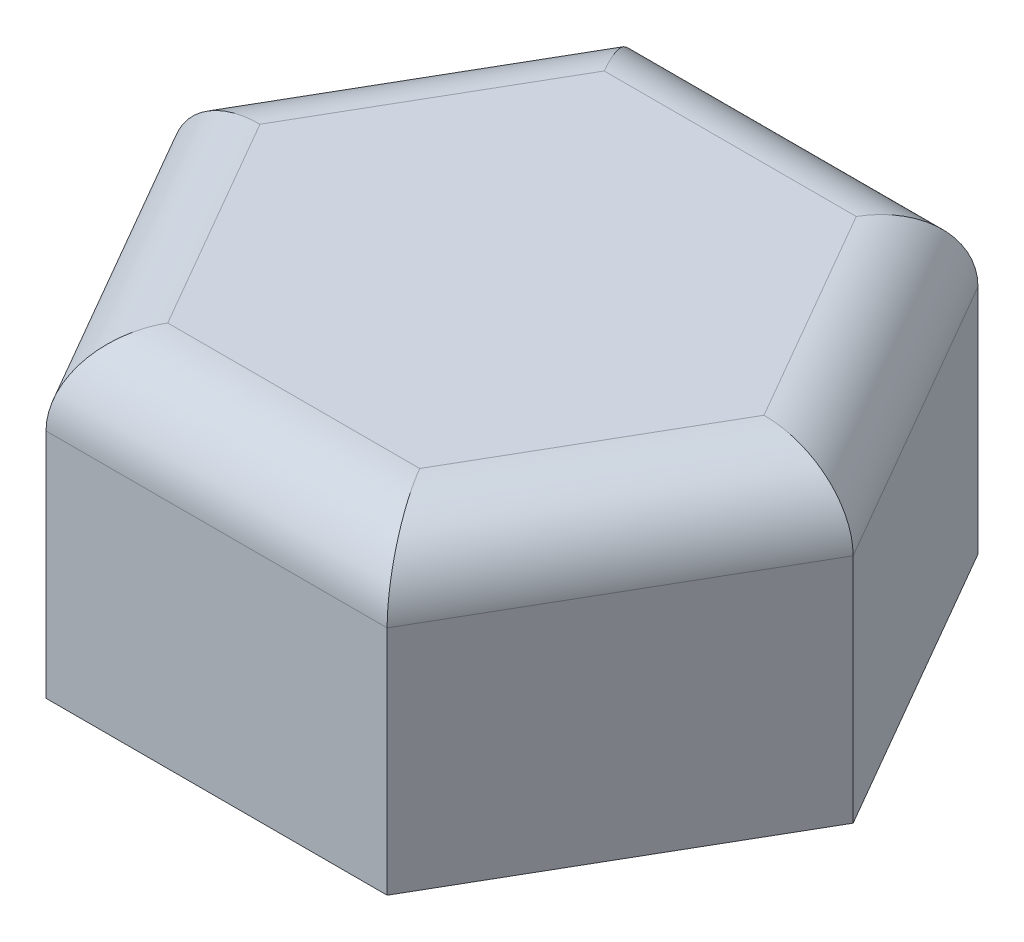
ISO-10303-21;
HEADER;
FILE_DESCRIPTION(('STEP AP214'),'2;1');
FILE_NAME('part.step','',(''),(''),'','','');
FILE_SCHEMA(('AUTOMOTIVE_DESIGN { 1 0 10303 214 1 1 1 1 }'));
ENDSEC;
DATA;
#1=APPLICATION_CONTEXT('core data for automotive mechanical design processes');
#2=APPLICATION_PROTOCOL_DEFINITION('international standard','automotive_design',2000,#1);
#3=PRODUCT_CONTEXT('',#1,'mechanical');
#4=PRODUCT('Part','Part','',(#3));
#5=PRODUCT_RELATED_PRODUCT_CATEGORY('part','',(#4));
#6=PRODUCT_DEFINITION_FORMATION('','',#4);
#7=PRODUCT_DEFINITION_CONTEXT('part definition',#1,'design');
#8=PRODUCT_DEFINITION('design','',#6,#7);
#9=PRODUCT_DEFINITION_SHAPE('','',#8);
#10=(LENGTH_UNIT() NAMED_UNIT(*) SI_UNIT(.MILLI.,.METRE.));
#11=(NAMED_UNIT(*) PLANE_ANGLE_UNIT() SI_UNIT($,.RADIAN.));
#12=(NAMED_UNIT(*) SI_UNIT($,.STERADIAN.) SOLID_ANGLE_UNIT());
#13=UNCERTAINTY_MEASURE_WITH_UNIT(LENGTH_MEASURE(1.E-05),#10,'distance_accuracy_value','');
#14=(GEOMETRIC_REPRESENTATION_CONTEXT(3) GLOBAL_UNCERTAINTY_ASSIGNED_CONTEXT((#13)) GLOBAL_UNIT_ASSIGNED_CONTEXT((#10,
#11,#12)) REPRESENTATION_CONTEXT('',''));
#15=CARTESIAN_POINT('',(0.,0.,0.));
#16=DIRECTION('',(0.,0.,1.));
#17=DIRECTION('',(1.,0.,0.));
#18=AXIS2_PLACEMENT_3D('',#15,#16,#17);
#19=CARTESIAN_POINT('',(0.,4.,0.));
#20=DIRECTION('',(0.,-1.,0.));
#21=DIRECTION('',(0.,0.,-1.));
#22=AXIS2_PLACEMENT_3D('',#19,#20,#21);
#23=CYLINDRICAL_SURFACE('',#22,2.4);
#24=CARTESIAN_POINT('',(0.,0.,0.));
#25=DIRECTION('',(0.,1.,0.));
#26=DIRECTION('',(0.,0.,1.));
#27=AXIS2_PLACEMENT_3D('',#24,#25,#26);
#28=CIRCLE('',#27,2.4);
#29=CARTESIAN_POINT('',(0.,0.,2.4));
#30=VERTEX_POINT('',#29);
#31=EDGE_CURVE('E144',#30,#30,#28,.T.);
#32=ORIENTED_EDGE('',*,*,#31,.F.);
#33=EDGE_LOOP('',(#32));
#34=FACE_BOUND('',#33,.T.);
#35=CARTESIAN_POINT('',(0.,1.,0.));
#36=DIRECTION('',(0.,1.,0.));
#37=DIRECTION('',(0.,0.,1.));
#38=AXIS2_PLACEMENT_3D('',#35,#36,#37);
#39=CIRCLE('',#38,2.4);
#40=CARTESIAN_POINT('',(0.,1.,2.4));
#41=VERTEX_POINT('',#40);
#42=EDGE_CURVE('E212',#41,#41,#39,.T.);
#43=ORIENTED_EDGE('',*,*,#42,.T.);
#44=EDGE_LOOP('',(#43));
#45=FACE_BOUND('',#44,.T.);
#46=ADVANCED_FACE('F41',(#34,#45),#23,.F.);
#47=CARTESIAN_POINT('',(0.,4.,0.));
#48=DIRECTION('',(0.,1.,0.));
#49=DIRECTION('',(0.,0.,1.));
#50=AXIS2_PLACEMENT_3D('',#47,#48,#49);
#51=PLANE('',#50);
#52=DIRECTION('',(-1.,0.,0.));
#53=VECTOR('',#52,1.);
#54=CARTESIAN_POINT('',(-2.20998121972278,4.,-2.82779975633281));
#55=LINE('',#54,#53);
#56=CARTESIAN_POINT('',(1.6326309505331,4.,-2.82779975633285));
#57=VERTEX_POINT('',#56);
#58=CARTESIAN_POINT('',(-1.63263095053316,4.,-2.82779975633282));
#59=VERTEX_POINT('',#58);
#60=EDGE_CURVE('E188',#57,#59,#55,.T.);
#61=ORIENTED_EDGE('',*,*,#60,.T.);
#62=DIRECTION('',(-0.499999999999995,0.,0.866025403784442));
#63=VECTOR('',#62,1.);
#64=CARTESIAN_POINT('',(-3.55393703566106,4.,0.499999999999995));
#65=LINE('',#64,#63);
#66=CARTESIAN_POINT('',(-3.26526190106625,4.,0.));
#67=VERTEX_POINT('',#66);
#68=EDGE_CURVE('E191',#59,#67,#65,.T.);
#69=ORIENTED_EDGE('',*,*,#68,.T.);
#70=DIRECTION('',(0.500000000000001,0.,0.866025403784438));
#71=VECTOR('',#70,1.);
#72=CARTESIAN_POINT('',(-1.3439558159383,4.,3.32779975633284));
#73=LINE('',#72,#71);
#74=CARTESIAN_POINT('',(-1.63263095053312,4.,2.82779975633284));
#75=VERTEX_POINT('',#74);
#76=EDGE_CURVE('E125',#67,#75,#73,.T.);
#77=ORIENTED_EDGE('',*,*,#76,.T.);
#78=DIRECTION('',(1.,0.,0.));
#79=VECTOR('',#78,1.);
#80=CARTESIAN_POINT('',(2.20998121972276,4.,2.82779975633283));
#81=LINE('',#80,#79);
#82=CARTESIAN_POINT('',(1.63263095053314,4.,2.82779975633283));
#83=VERTEX_POINT('',#82);
#84=EDGE_CURVE('E179',#75,#83,#81,.T.);
#85=ORIENTED_EDGE('',*,*,#84,.T.);
#86=DIRECTION('',(0.499999999999995,0.,-0.866025403784442));
#87=VECTOR('',#86,1.);
#88=CARTESIAN_POINT('',(3.55393703566105,4.,-0.500000000000026));
#89=LINE('',#88,#87);
#90=CARTESIAN_POINT('',(3.26526190106624,4.,0.));
#91=VERTEX_POINT('',#90);
#92=EDGE_CURVE('E182',#83,#91,#89,.T.);
#93=ORIENTED_EDGE('',*,*,#92,.T.);
#94=DIRECTION('',(-0.500000000000007,0.,-0.866025403784435));
#95=VECTOR('',#94,1.);
#96=CARTESIAN_POINT('',(1.34395581593828,4.,-3.32779975633285));
#97=LINE('',#96,#95);
#98=EDGE_CURVE('E185',#91,#57,#97,.T.);
#99=ORIENTED_EDGE('',*,*,#98,.T.);
#100=EDGE_LOOP('',(#61,#69,#77,#85,#93,#99));
#101=FACE_BOUND('',#100,.T.);
#102=ADVANCED_FACE('F266',(#101),#51,.T.);
#103=CARTESIAN_POINT('',(0.,0.,0.));
#104=DIRECTION('',(0.,1.,0.));
#105=DIRECTION('',(0.,0.,1.));
#106=AXIS2_PLACEMENT_3D('',#103,#104,#105);
#107=PLANE('',#106);
#108=DIRECTION('',(-0.499999999999995,0.,0.866025403784442));
#109=VECTOR('',#108,1.);
#110=CARTESIAN_POINT('',(-2.20998121972279,0.,-3.82779975633281));
#111=LINE('',#110,#109);
#112=CARTESIAN_POINT('',(-2.20998121972279,0.,-3.82779975633281));
#113=VERTEX_POINT('',#112);
#114=CARTESIAN_POINT('',(-4.4199624394455,0.,0.));
#115=VERTEX_POINT('',#114);
#116=EDGE_CURVE('E133',#113,#115,#111,.T.);
#117=ORIENTED_EDGE('',*,*,#116,.F.);
#118=DIRECTION('',(-1.,0.,0.));
#119=VECTOR('',#118,1.);
#120=CARTESIAN_POINT('',(2.20998121972271,0.,-3.82779975633286));
#121=LINE('',#120,#119);
#122=CARTESIAN_POINT('',(2.20998121972271,0.,-3.82779975633286));
#123=VERTEX_POINT('',#122);
#124=EDGE_CURVE('E161',#123,#113,#121,.T.);
#125=ORIENTED_EDGE('',*,*,#124,.F.);
#126=DIRECTION('',(-0.500000000000007,0.,-0.866025403784435));
#127=VECTOR('',#126,1.);
#128=CARTESIAN_POINT('',(4.4199624394455,0.,0.));
#129=LINE('',#128,#127);
#130=CARTESIAN_POINT('',(4.4199624394455,0.,0.));
#131=VERTEX_POINT('',#130);
#132=EDGE_CURVE('E157',#131,#123,#129,.T.);
#133=ORIENTED_EDGE('',*,*,#132,.F.);
#134=DIRECTION('',(0.499999999999995,0.,-0.866025403784442));
#135=VECTOR('',#134,1.);
#136=CARTESIAN_POINT('',(2.20998121972277,0.,3.82779975633283));
#137=LINE('',#136,#135);
#138=CARTESIAN_POINT('',(2.20998121972277,0.,3.82779975633283));
#139=VERTEX_POINT('',#138);
#140=EDGE_CURVE('E153',#139,#131,#137,.T.);
#141=ORIENTED_EDGE('',*,*,#140,.F.);
#142=DIRECTION('',(1.,0.,0.));
#143=VECTOR('',#142,1.);
#144=CARTESIAN_POINT('',(-2.20998121972274,0.,3.82779975633284));
#145=LINE('',#144,#143);
#146=CARTESIAN_POINT('',(-2.20998121972274,0.,3.82779975633284));
#147=VERTEX_POINT('',#146);
#148=EDGE_CURVE('E136',#147,#139,#145,.T.);
#149=ORIENTED_EDGE('',*,*,#148,.F.);
#150=DIRECTION('',(0.500000000000001,0.,0.866025403784438));
#151=VECTOR('',#150,1.);
#152=CARTESIAN_POINT('',(-4.4199624394455,0.,0.));
#153=LINE('',#152,#151);
#154=EDGE_CURVE('E117',#115,#147,#153,.T.);
#155=ORIENTED_EDGE('',*,*,#154,.F.);
#156=EDGE_LOOP('',(#117,#125,#133,#141,#149,#155));
#157=FACE_BOUND('',#156,.T.);
#158=ORIENTED_EDGE('',*,*,#31,.T.);
#159=EDGE_LOOP('',(#158));
#160=FACE_BOUND('',#159,.T.);
#161=ADVANCED_FACE('F130',(#157,#160),#107,.F.);
#162=CARTESIAN_POINT('',(-2.20998121972279,4.,-3.82779975633281));
#163=DIRECTION('',(0.866025403784442,0.,0.499999999999995));
#164=DIRECTION('',(0.499999999999995,0.,-0.866025403784442));
#165=AXIS2_PLACEMENT_3D('',#162,#163,#164);
#166=PLANE('',#165);
#167=DIRECTION('',(0.,-1.,0.));
#168=VECTOR('',#167,1.);
#169=CARTESIAN_POINT('',(-4.4199624394455,4.,0.));
#170=LINE('',#169,#168);
#171=CARTESIAN_POINT('',(-4.4199624394455,3.,0.));
#172=VERTEX_POINT('',#171);
#173=EDGE_CURVE('E114',#172,#115,#170,.T.);
#174=ORIENTED_EDGE('',*,*,#173,.F.);
#175=DIRECTION('',(-0.499999999999995,0.,0.866025403784442));
#176=VECTOR('',#175,1.);
#177=CARTESIAN_POINT('',(-2.20998121972279,3.,-3.82779975633281));
#178=LINE('',#177,#176);
#179=CARTESIAN_POINT('',(-2.20998121972279,3.,-3.82779975633281));
#180=VERTEX_POINT('',#179);
#181=EDGE_CURVE('E195',#172,#180,#178,.F.);
#182=ORIENTED_EDGE('',*,*,#181,.T.);
#183=DIRECTION('',(0.,-1.,0.));
#184=VECTOR('',#183,1.);
#185=CARTESIAN_POINT('',(-2.20998121972279,4.,-3.82779975633281));
#186=LINE('',#185,#184);
#187=EDGE_CURVE('E141',#180,#113,#186,.T.);
#188=ORIENTED_EDGE('',*,*,#187,.T.);
#189=ORIENTED_EDGE('',*,*,#116,.T.);
#190=EDGE_LOOP('',(#174,#182,#188,#189));
#191=FACE_BOUND('',#190,.T.);
#192=ADVANCED_FACE('F139',(#191),#166,.F.);
#193=CARTESIAN_POINT('',(-4.4199624394455,4.,0.));
#194=DIRECTION('',(0.866025403784438,0.,-0.500000000000001));
#195=DIRECTION('',(-0.500000000000001,0.,-0.866025403784438));
#196=AXIS2_PLACEMENT_3D('',#193,#194,#195);
#197=PLANE('',#196);
#198=DIRECTION('',(0.,-1.,0.));
#199=VECTOR('',#198,1.);
#200=CARTESIAN_POINT('',(-2.20998121972274,4.,3.82779975633284));
#201=LINE('',#200,#199);
#202=CARTESIAN_POINT('',(-2.20998121972274,3.,3.82779975633284));
#203=VERTEX_POINT('',#202);
#204=EDGE_CURVE('E126',#203,#147,#201,.T.);
#205=ORIENTED_EDGE('',*,*,#204,.F.);
#206=DIRECTION('',(0.500000000000001,0.,0.866025403784438));
#207=VECTOR('',#206,1.);
#208=CARTESIAN_POINT('',(-4.4199624394455,3.,0.));
#209=LINE('',#208,#207);
#210=EDGE_CURVE('E11',#203,#172,#209,.F.);
#211=ORIENTED_EDGE('',*,*,#210,.T.);
#212=ORIENTED_EDGE('',*,*,#173,.T.);
#213=ORIENTED_EDGE('',*,*,#154,.T.);
#214=EDGE_LOOP('',(#205,#211,#212,#213));
#215=FACE_BOUND('',#214,.T.);
#216=ADVANCED_FACE('F116',(#215),#197,.F.);
#217=CARTESIAN_POINT('',(-2.20998121972274,4.,3.82779975633284));
#218=DIRECTION('',(0.,0.,-1.));
#219=DIRECTION('',(-1.,0.,0.));
#220=AXIS2_PLACEMENT_3D('',#217,#218,#219);
#221=PLANE('',#220);
#222=DIRECTION('',(0.,-1.,0.));
#223=VECTOR('',#222,1.);
#224=CARTESIAN_POINT('',(2.20998121972277,4.,3.82779975633283));
#225=LINE('',#224,#223);
#226=CARTESIAN_POINT('',(2.20998121972277,3.,3.82779975633283));
#227=VERTEX_POINT('',#226);
#228=EDGE_CURVE('E172',#227,#139,#225,.T.);
#229=ORIENTED_EDGE('',*,*,#228,.F.);
#230=DIRECTION('',(1.,0.,0.));
#231=VECTOR('',#230,1.);
#232=CARTESIAN_POINT('',(-2.20998121972274,3.,3.82779975633284));
#233=LINE('',#232,#231);
#234=EDGE_CURVE('E51',#227,#203,#233,.F.);
#235=ORIENTED_EDGE('',*,*,#234,.T.);
#236=ORIENTED_EDGE('',*,*,#204,.T.);
#237=ORIENTED_EDGE('',*,*,#148,.T.);
#238=EDGE_LOOP('',(#229,#235,#236,#237));
#239=FACE_BOUND('',#238,.T.);
#240=ADVANCED_FACE('F256',(#239),#221,.F.);
#241=CARTESIAN_POINT('',(2.20998121972277,4.,3.82779975633283));
#242=DIRECTION('',(-0.866025403784442,0.,-0.499999999999995));
#243=DIRECTION('',(-0.499999999999995,0.,0.866025403784442));
#244=AXIS2_PLACEMENT_3D('',#241,#242,#243);
#245=PLANE('',#244);
#246=DIRECTION('',(0.,-1.,0.));
#247=VECTOR('',#246,1.);
#248=CARTESIAN_POINT('',(4.4199624394455,4.,0.));
#249=LINE('',#248,#247);
#250=CARTESIAN_POINT('',(4.4199624394455,3.,0.));
#251=VERTEX_POINT('',#250);
#252=EDGE_CURVE('E169',#251,#131,#249,.T.);
#253=ORIENTED_EDGE('',*,*,#252,.F.);
#254=DIRECTION('',(0.499999999999995,0.,-0.866025403784442));
#255=VECTOR('',#254,1.);
#256=CARTESIAN_POINT('',(2.20998121972277,3.,3.82779975633283));
#257=LINE('',#256,#255);
#258=EDGE_CURVE('E66',#251,#227,#257,.F.);
#259=ORIENTED_EDGE('',*,*,#258,.T.);
#260=ORIENTED_EDGE('',*,*,#228,.T.);
#261=ORIENTED_EDGE('',*,*,#140,.T.);
#262=EDGE_LOOP('',(#253,#259,#260,#261));
#263=FACE_BOUND('',#262,.T.);
#264=ADVANCED_FACE('F255',(#263),#245,.F.);
#265=CARTESIAN_POINT('',(4.4199624394455,4.,0.));
#266=DIRECTION('',(-0.866025403784435,0.,0.500000000000007));
#267=DIRECTION('',(0.500000000000007,0.,0.866025403784435));
#268=AXIS2_PLACEMENT_3D('',#265,#266,#267);
#269=PLANE('',#268);
#270=DIRECTION('',(0.,-1.,0.));
#271=VECTOR('',#270,1.);
#272=CARTESIAN_POINT('',(2.20998121972271,4.,-3.82779975633286));
#273=LINE('',#272,#271);
#274=CARTESIAN_POINT('',(2.20998121972271,3.,-3.82779975633286));
#275=VERTEX_POINT('',#274);
#276=EDGE_CURVE('E166',#275,#123,#273,.T.);
#277=ORIENTED_EDGE('',*,*,#276,.F.);
#278=DIRECTION('',(-0.500000000000007,0.,-0.866025403784435));
#279=VECTOR('',#278,1.);
#280=CARTESIAN_POINT('',(4.4199624394455,3.,0.));
#281=LINE('',#280,#279);
#282=EDGE_CURVE('E201',#275,#251,#281,.F.);
#283=ORIENTED_EDGE('',*,*,#282,.T.);
#284=ORIENTED_EDGE('',*,*,#252,.T.);
#285=ORIENTED_EDGE('',*,*,#132,.T.);
#286=EDGE_LOOP('',(#277,#283,#284,#285));
#287=FACE_BOUND('',#286,.T.);
#288=ADVANCED_FACE('F254',(#287),#269,.F.);
#289=CARTESIAN_POINT('',(2.20998121972271,4.,-3.82779975633286));
#290=DIRECTION('',(0.,0.,1.));
#291=DIRECTION('',(1.,0.,0.));
#292=AXIS2_PLACEMENT_3D('',#289,#290,#291);
#293=PLANE('',#292);
#294=ORIENTED_EDGE('',*,*,#187,.F.);
#295=DIRECTION('',(-1.,0.,0.));
#296=VECTOR('',#295,1.);
#297=CARTESIAN_POINT('',(2.20998121972271,3.,-3.82779975633286));
#298=LINE('',#297,#296);
#299=EDGE_CURVE('E198',#180,#275,#298,.F.);
#300=ORIENTED_EDGE('',*,*,#299,.T.);
#301=ORIENTED_EDGE('',*,*,#276,.T.);
#302=ORIENTED_EDGE('',*,*,#124,.T.);
#303=EDGE_LOOP('',(#294,#300,#301,#302));
#304=FACE_BOUND('',#303,.T.);
#305=ADVANCED_FACE('F250',(#304),#293,.F.);
#306=CARTESIAN_POINT('',(2.44894642579969,3.,1.4138998781664));
#307=DIRECTION('',(-0.499999999999995,0.,0.866025403784442));
#308=DIRECTION('',(0.866025403784442,0.,0.499999999999995));
#309=AXIS2_PLACEMENT_3D('',#306,#307,#308);
#310=CYLINDRICAL_SURFACE('',#309,1.);
#311=CARTESIAN_POINT('',(1.63263095053313,3.,2.82779975633283));
#312=DIRECTION('',(-0.866025403784436,0.,0.500000000000004));
#313=DIRECTION('',(-0.500000000000004,0.,-0.866025403784436));
#314=AXIS2_PLACEMENT_3D('',#311,#312,#313);
#315=ELLIPSE('',#314,1.15470053837925,1.);
#316=EDGE_CURVE('E222',#227,#83,#315,.T.);
#317=ORIENTED_EDGE('',*,*,#316,.F.);
#318=ORIENTED_EDGE('',*,*,#258,.F.);
#319=CARTESIAN_POINT('',(3.26526190106624,3.,0.));
#320=DIRECTION('',(0.,0.,1.));
#321=DIRECTION('',(-1.,0.,0.));
#322=AXIS2_PLACEMENT_3D('',#319,#320,#321);
#323=ELLIPSE('',#322,1.15470053837925,1.);
#324=EDGE_CURVE('E45',#91,#251,#323,.F.);
#325=ORIENTED_EDGE('',*,*,#324,.F.);
#326=ORIENTED_EDGE('',*,*,#92,.F.);
#327=EDGE_LOOP('',(#317,#318,#325,#326));
#328=FACE_BOUND('',#327,.T.);
#329=ADVANCED_FACE('F43',(#328),#310,.T.);
#330=CARTESIAN_POINT('',(2.44894642579967,3.,-1.41389987816644));
#331=DIRECTION('',(0.500000000000007,0.,0.866025403784435));
#332=DIRECTION('',(0.866025403784435,0.,-0.500000000000007));
#333=AXIS2_PLACEMENT_3D('',#330,#331,#332);
#334=CYLINDRICAL_SURFACE('',#333,1.);
#335=ORIENTED_EDGE('',*,*,#324,.T.);
#336=ORIENTED_EDGE('',*,*,#282,.F.);
#337=CARTESIAN_POINT('',(1.6326309505331,3.,-2.82779975633285));
#338=DIRECTION('',(0.866025403784443,0.,0.499999999999992));
#339=DIRECTION('',(-0.499999999999992,0.,0.866025403784443));
#340=AXIS2_PLACEMENT_3D('',#337,#338,#339);
#341=ELLIPSE('',#340,1.15470053837925,1.);
#342=EDGE_CURVE('E219',#57,#275,#341,.F.);
#343=ORIENTED_EDGE('',*,*,#342,.F.);
#344=ORIENTED_EDGE('',*,*,#98,.F.);
#345=EDGE_LOOP('',(#335,#336,#343,#344));
#346=FACE_BOUND('',#345,.T.);
#347=ADVANCED_FACE('F234',(#346),#334,.T.);
#348=CARTESIAN_POINT('',(0.,3.,2.82779975633284));
#349=DIRECTION('',(-1.,0.,0.));
#350=DIRECTION('',(0.,0.,1.));
#351=AXIS2_PLACEMENT_3D('',#348,#349,#350);
#352=CYLINDRICAL_SURFACE('',#351,1.);
#353=ORIENTED_EDGE('',*,*,#316,.T.);
#354=ORIENTED_EDGE('',*,*,#84,.F.);
#355=CARTESIAN_POINT('',(-1.63263095053312,3.,2.82779975633284));
#356=DIRECTION('',(-0.86602540378444,0.,-0.499999999999998));
#357=DIRECTION('',(0.499999999999998,0.,-0.86602540378444));
#358=AXIS2_PLACEMENT_3D('',#355,#356,#357);
#359=ELLIPSE('',#358,1.15470053837925,1.);
#360=EDGE_CURVE('E215',#203,#75,#359,.T.);
#361=ORIENTED_EDGE('',*,*,#360,.F.);
#362=ORIENTED_EDGE('',*,*,#234,.F.);
#363=EDGE_LOOP('',(#353,#354,#361,#362));
#364=FACE_BOUND('',#363,.T.);
#365=ADVANCED_FACE('F239',(#364),#352,.T.);
#366=CARTESIAN_POINT('',(0.,3.,-2.82779975633284));
#367=DIRECTION('',(1.,0.,0.));
#368=DIRECTION('',(0.,0.,-1.));
#369=AXIS2_PLACEMENT_3D('',#366,#367,#368);
#370=CYLINDRICAL_SURFACE('',#369,1.);
#371=ORIENTED_EDGE('',*,*,#342,.T.);
#372=ORIENTED_EDGE('',*,*,#299,.F.);
#373=CARTESIAN_POINT('',(-1.63263095053316,3.,-2.82779975633282));
#374=DIRECTION('',(0.866025403784434,0.,-0.500000000000007));
#375=DIRECTION('',(0.500000000000007,0.,0.866025403784435));
#376=AXIS2_PLACEMENT_3D('',#373,#374,#375);
#377=ELLIPSE('',#376,1.15470053837925,1.);
#378=EDGE_CURVE('E211',#59,#180,#377,.F.);
#379=ORIENTED_EDGE('',*,*,#378,.F.);
#380=ORIENTED_EDGE('',*,*,#60,.F.);
#381=EDGE_LOOP('',(#371,#372,#379,#380));
#382=FACE_BOUND('',#381,.T.);
#383=ADVANCED_FACE('F308',(#382),#370,.T.);
#384=CARTESIAN_POINT('',(-2.44894642579968,3.,1.41389987816642));
#385=DIRECTION('',(-0.500000000000001,0.,-0.866025403784438));
#386=DIRECTION('',(-0.866025403784438,0.,0.500000000000001));
#387=AXIS2_PLACEMENT_3D('',#384,#385,#386);
#388=CYLINDRICAL_SURFACE('',#387,1.);
#389=ORIENTED_EDGE('',*,*,#360,.T.);
#390=ORIENTED_EDGE('',*,*,#76,.F.);
#391=CARTESIAN_POINT('',(-3.26526190106625,3.,0.));
#392=DIRECTION('',(0.,0.,-1.));
#393=DIRECTION('',(-1.,0.,0.));
#394=AXIS2_PLACEMENT_3D('',#391,#392,#393);
#395=ELLIPSE('',#394,1.15470053837925,1.);
#396=EDGE_CURVE('E208',#172,#67,#395,.T.);
#397=ORIENTED_EDGE('',*,*,#396,.F.);
#398=ORIENTED_EDGE('',*,*,#210,.F.);
#399=EDGE_LOOP('',(#389,#390,#397,#398));
#400=FACE_BOUND('',#399,.T.);
#401=ADVANCED_FACE('F243',(#400),#388,.T.);
#402=CARTESIAN_POINT('',(-2.4489464257997,3.,-1.41389987816641));
#403=DIRECTION('',(0.499999999999995,0.,-0.866025403784442));
#404=DIRECTION('',(-0.866025403784442,0.,-0.499999999999995));
#405=AXIS2_PLACEMENT_3D('',#402,#403,#404);
#406=CYLINDRICAL_SURFACE('',#405,1.);
#407=ORIENTED_EDGE('',*,*,#378,.T.);
#408=ORIENTED_EDGE('',*,*,#181,.F.);
#409=ORIENTED_EDGE('',*,*,#396,.T.);
#410=ORIENTED_EDGE('',*,*,#68,.F.);
#411=EDGE_LOOP('',(#407,#408,#409,#410));
#412=FACE_BOUND('',#411,.T.);
#413=ADVANCED_FACE('F246',(#412),#406,.T.);
#414=CARTESIAN_POINT('',(0.,1.,0.));
#415=DIRECTION('',(0.,1.,0.));
#416=DIRECTION('',(0.,0.,1.));
#417=AXIS2_PLACEMENT_3D('',#414,#415,#416);
#418=PLANE('',#417);
#419=ORIENTED_EDGE('',*,*,#42,.F.);
#420=EDGE_LOOP('',(#419));
#421=FACE_BOUND('',#420,.T.);
#422=ADVANCED_FACE('F277',(#421),#418,.F.);
#423=CLOSED_SHELL('',(#46,#102,#161,#192,#216,#240,#264,#288,#305,#329,#347,#365,#383,#401,#413,#422));
#424=MANIFOLD_SOLID_BREP('B2',#423);
#425=ADVANCED_BREP_SHAPE_REPRESENTATION('',(#18,#424),#14);
#426=SHAPE_DEFINITION_REPRESENTATION(#9,#425);
ENDSEC;
END-ISO-10303-21;
